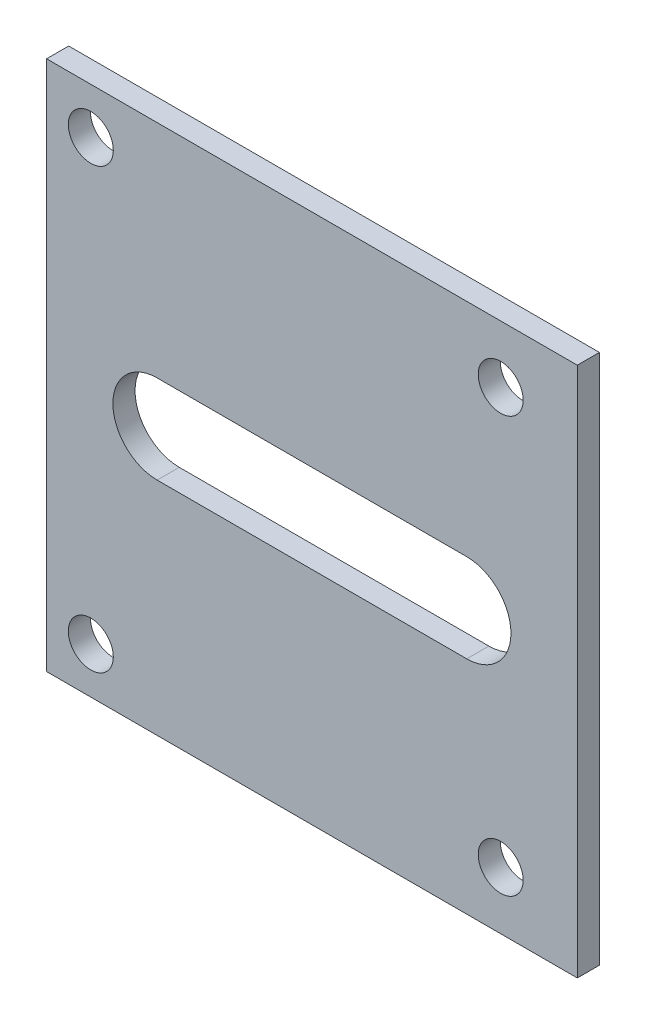
ISO-10303-21;
HEADER;
FILE_DESCRIPTION(('STEP AP214'),'2;1');
FILE_NAME('part.step','',(''),(''),'','','');
FILE_SCHEMA(('AUTOMOTIVE_DESIGN { 1 0 10303 214 1 1 1 1 }'));
ENDSEC;
DATA;
#1=APPLICATION_CONTEXT('core data for automotive mechanical design processes');
#2=APPLICATION_PROTOCOL_DEFINITION('international standard','automotive_design',2000,#1);
#3=PRODUCT_CONTEXT('',#1,'mechanical');
#4=PRODUCT('Part','Part','',(#3));
#5=PRODUCT_RELATED_PRODUCT_CATEGORY('part','',(#4));
#6=PRODUCT_DEFINITION_FORMATION('','',#4);
#7=PRODUCT_DEFINITION_CONTEXT('part definition',#1,'design');
#8=PRODUCT_DEFINITION('design','',#6,#7);
#9=PRODUCT_DEFINITION_SHAPE('','',#8);
#10=(LENGTH_UNIT() NAMED_UNIT(*) SI_UNIT(.MILLI.,.METRE.));
#11=(NAMED_UNIT(*) PLANE_ANGLE_UNIT() SI_UNIT($,.RADIAN.));
#12=(NAMED_UNIT(*) SI_UNIT($,.STERADIAN.) SOLID_ANGLE_UNIT());
#13=UNCERTAINTY_MEASURE_WITH_UNIT(LENGTH_MEASURE(1.E-05),#10,'distance_accuracy_value','');
#14=(GEOMETRIC_REPRESENTATION_CONTEXT(3) GLOBAL_UNCERTAINTY_ASSIGNED_CONTEXT((#13)) GLOBAL_UNIT_ASSIGNED_CONTEXT((#10,
#11,#12)) REPRESENTATION_CONTEXT('',''));
#15=CARTESIAN_POINT('',(0.,0.,0.));
#16=DIRECTION('',(0.,0.,1.));
#17=DIRECTION('',(1.,0.,0.));
#18=AXIS2_PLACEMENT_3D('',#15,#16,#17);
#19=CARTESIAN_POINT('',(0.,0.,3.175));
#20=DIRECTION('',(0.,0.,-1.));
#21=DIRECTION('',(-1.,0.,0.));
#22=AXIS2_PLACEMENT_3D('',#19,#20,#21);
#23=PLANE('',#22);
#24=DIRECTION('',(1.,0.,0.));
#25=VECTOR('',#24,1.);
#26=CARTESIAN_POINT('',(15.875,31.75,3.175));
#27=LINE('',#26,#25);
#28=CARTESIAN_POINT('',(15.875,31.75,3.175));
#29=VERTEX_POINT('',#28);
#30=CARTESIAN_POINT('',(60.325,31.75,3.175));
#31=VERTEX_POINT('',#30);
#32=EDGE_CURVE('E125',#29,#31,#27,.T.);
#33=ORIENTED_EDGE('',*,*,#32,.F.);
#34=CARTESIAN_POINT('',(15.875,38.1,3.175));
#35=DIRECTION('',(0.,0.,1.));
#36=DIRECTION('',(1.,0.,0.));
#37=AXIS2_PLACEMENT_3D('',#34,#35,#36);
#38=CIRCLE('',#37,6.35);
#39=CARTESIAN_POINT('',(15.875,44.45,3.175));
#40=VERTEX_POINT('',#39);
#41=EDGE_CURVE('E48',#40,#29,#38,.T.);
#42=ORIENTED_EDGE('',*,*,#41,.F.);
#43=DIRECTION('',(-1.,0.,0.));
#44=VECTOR('',#43,1.);
#45=CARTESIAN_POINT('',(15.875,44.45,3.175));
#46=LINE('',#45,#44);
#47=CARTESIAN_POINT('',(60.325,44.45,3.175));
#48=VERTEX_POINT('',#47);
#49=EDGE_CURVE('E116',#48,#40,#46,.T.);
#50=ORIENTED_EDGE('',*,*,#49,.F.);
#51=CARTESIAN_POINT('',(60.325,38.1,3.175));
#52=DIRECTION('',(0.,0.,1.));
#53=DIRECTION('',(1.,0.,0.));
#54=AXIS2_PLACEMENT_3D('',#51,#52,#53);
#55=CIRCLE('',#54,6.35);
#56=EDGE_CURVE('E119',#31,#48,#55,.T.);
#57=ORIENTED_EDGE('',*,*,#56,.F.);
#58=EDGE_LOOP('',(#33,#42,#50,#57));
#59=FACE_BOUND('',#58,.T.);
#60=CARTESIAN_POINT('',(65.2018,67.945,3.175));
#61=DIRECTION('',(0.,0.,1.));
#62=DIRECTION('',(1.,0.,0.));
#63=AXIS2_PLACEMENT_3D('',#60,#61,#62);
#64=CIRCLE('',#63,3.22909773874974);
#65=CARTESIAN_POINT('',(68.4308977387497,67.945,3.175));
#66=VERTEX_POINT('',#65);
#67=EDGE_CURVE('E141',#66,#66,#64,.T.);
#68=ORIENTED_EDGE('',*,*,#67,.F.);
#69=EDGE_LOOP('',(#68));
#70=FACE_BOUND('',#69,.T.);
#71=CARTESIAN_POINT('',(6.35,69.596,3.175));
#72=DIRECTION('',(0.,0.,1.));
#73=DIRECTION('',(1.,0.,0.));
#74=AXIS2_PLACEMENT_3D('',#71,#72,#73);
#75=CIRCLE('',#74,3.22909773874974);
#76=CARTESIAN_POINT('',(9.57909773874974,69.596,3.175));
#77=VERTEX_POINT('',#76);
#78=EDGE_CURVE('E153',#77,#77,#75,.T.);
#79=ORIENTED_EDGE('',*,*,#78,.F.);
#80=EDGE_LOOP('',(#79));
#81=FACE_BOUND('',#80,.T.);
#82=DIRECTION('',(0.,-1.,0.));
#83=VECTOR('',#82,1.);
#84=CARTESIAN_POINT('',(0.,0.,3.175));
#85=LINE('',#84,#83);
#86=CARTESIAN_POINT('',(0.,76.2,3.175));
#87=VERTEX_POINT('',#86);
#88=CARTESIAN_POINT('',(0.,0.,3.175));
#89=VERTEX_POINT('',#88);
#90=EDGE_CURVE('E159',#87,#89,#85,.T.);
#91=ORIENTED_EDGE('',*,*,#90,.T.);
#92=DIRECTION('',(1.,0.,0.));
#93=VECTOR('',#92,1.);
#94=CARTESIAN_POINT('',(0.,0.,3.175));
#95=LINE('',#94,#93);
#96=CARTESIAN_POINT('',(76.2,0.,3.175));
#97=VERTEX_POINT('',#96);
#98=EDGE_CURVE('E162',#89,#97,#95,.T.);
#99=ORIENTED_EDGE('',*,*,#98,.T.);
#100=DIRECTION('',(0.,1.,0.));
#101=VECTOR('',#100,1.);
#102=CARTESIAN_POINT('',(76.2,76.2,3.175));
#103=LINE('',#102,#101);
#104=CARTESIAN_POINT('',(76.2,76.2,3.175));
#105=VERTEX_POINT('',#104);
#106=EDGE_CURVE('E165',#97,#105,#103,.T.);
#107=ORIENTED_EDGE('',*,*,#106,.T.);
#108=DIRECTION('',(-1.,0.,0.));
#109=VECTOR('',#108,1.);
#110=CARTESIAN_POINT('',(0.,76.2,3.175));
#111=LINE('',#110,#109);
#112=EDGE_CURVE('E167',#105,#87,#111,.T.);
#113=ORIENTED_EDGE('',*,*,#112,.T.);
#114=EDGE_LOOP('',(#91,#99,#107,#113));
#115=FACE_BOUND('',#114,.T.);
#116=CARTESIAN_POINT('',(6.35,6.60400000000028,3.175));
#117=DIRECTION('',(0.,0.,1.));
#118=DIRECTION('',(1.,0.,0.));
#119=AXIS2_PLACEMENT_3D('',#116,#117,#118);
#120=CIRCLE('',#119,3.22909773874974);
#121=CARTESIAN_POINT('',(9.57909773874974,6.60400000000028,3.175));
#122=VERTEX_POINT('',#121);
#123=EDGE_CURVE('E147',#122,#122,#120,.T.);
#124=ORIENTED_EDGE('',*,*,#123,.F.);
#125=EDGE_LOOP('',(#124));
#126=FACE_BOUND('',#125,.T.);
#127=CARTESIAN_POINT('',(65.2018,8.25500000000001,3.175));
#128=DIRECTION('',(0.,0.,1.));
#129=DIRECTION('',(1.,0.,0.));
#130=AXIS2_PLACEMENT_3D('',#127,#128,#129);
#131=CIRCLE('',#130,3.22909773874974);
#132=CARTESIAN_POINT('',(68.4308977387497,8.25500000000001,3.175));
#133=VERTEX_POINT('',#132);
#134=EDGE_CURVE('E135',#133,#133,#131,.T.);
#135=ORIENTED_EDGE('',*,*,#134,.F.);
#136=EDGE_LOOP('',(#135));
#137=FACE_BOUND('',#136,.T.);
#138=ADVANCED_FACE('F33',(#59,#70,#81,#115,#126,#137),#23,.F.);
#139=CARTESIAN_POINT('',(0.,0.,0.));
#140=DIRECTION('',(0.,0.,-1.));
#141=DIRECTION('',(-1.,0.,0.));
#142=AXIS2_PLACEMENT_3D('',#139,#140,#141);
#143=PLANE('',#142);
#144=CARTESIAN_POINT('',(15.875,38.1,0.));
#145=DIRECTION('',(0.,0.,1.));
#146=DIRECTION('',(1.,0.,0.));
#147=AXIS2_PLACEMENT_3D('',#144,#145,#146);
#148=CIRCLE('',#147,6.35);
#149=CARTESIAN_POINT('',(15.875,44.45,0.));
#150=VERTEX_POINT('',#149);
#151=CARTESIAN_POINT('',(15.875,31.75,0.));
#152=VERTEX_POINT('',#151);
#153=EDGE_CURVE('E100',#150,#152,#148,.T.);
#154=ORIENTED_EDGE('',*,*,#153,.T.);
#155=DIRECTION('',(1.,0.,0.));
#156=VECTOR('',#155,1.);
#157=CARTESIAN_POINT('',(15.875,31.75,0.));
#158=LINE('',#157,#156);
#159=CARTESIAN_POINT('',(60.325,31.75,0.));
#160=VERTEX_POINT('',#159);
#161=EDGE_CURVE('E109',#152,#160,#158,.T.);
#162=ORIENTED_EDGE('',*,*,#161,.T.);
#163=CARTESIAN_POINT('',(60.325,38.1,0.));
#164=DIRECTION('',(0.,0.,1.));
#165=DIRECTION('',(1.,0.,0.));
#166=AXIS2_PLACEMENT_3D('',#163,#164,#165);
#167=CIRCLE('',#166,6.35);
#168=CARTESIAN_POINT('',(60.325,44.45,0.));
#169=VERTEX_POINT('',#168);
#170=EDGE_CURVE('E56',#160,#169,#167,.T.);
#171=ORIENTED_EDGE('',*,*,#170,.T.);
#172=DIRECTION('',(-1.,0.,0.));
#173=VECTOR('',#172,1.);
#174=CARTESIAN_POINT('',(15.875,44.45,0.));
#175=LINE('',#174,#173);
#176=EDGE_CURVE('E106',#169,#150,#175,.T.);
#177=ORIENTED_EDGE('',*,*,#176,.T.);
#178=EDGE_LOOP('',(#154,#162,#171,#177));
#179=FACE_BOUND('',#178,.T.);
#180=CARTESIAN_POINT('',(65.2018,67.945,0.));
#181=DIRECTION('',(0.,0.,1.));
#182=DIRECTION('',(1.,0.,0.));
#183=AXIS2_PLACEMENT_3D('',#180,#181,#182);
#184=CIRCLE('',#183,3.22909773874974);
#185=CARTESIAN_POINT('',(68.4308977387497,67.945,0.));
#186=VERTEX_POINT('',#185);
#187=EDGE_CURVE('E138',#186,#186,#184,.T.);
#188=ORIENTED_EDGE('',*,*,#187,.T.);
#189=EDGE_LOOP('',(#188));
#190=FACE_BOUND('',#189,.T.);
#191=CARTESIAN_POINT('',(6.35,69.596,0.));
#192=DIRECTION('',(0.,0.,1.));
#193=DIRECTION('',(1.,0.,0.));
#194=AXIS2_PLACEMENT_3D('',#191,#192,#193);
#195=CIRCLE('',#194,3.22909773874974);
#196=CARTESIAN_POINT('',(9.57909773874974,69.596,0.));
#197=VERTEX_POINT('',#196);
#198=EDGE_CURVE('E150',#197,#197,#195,.T.);
#199=ORIENTED_EDGE('',*,*,#198,.T.);
#200=EDGE_LOOP('',(#199));
#201=FACE_BOUND('',#200,.T.);
#202=DIRECTION('',(0.,-1.,0.));
#203=VECTOR('',#202,1.);
#204=CARTESIAN_POINT('',(0.,0.,0.));
#205=LINE('',#204,#203);
#206=CARTESIAN_POINT('',(0.,76.2,0.));
#207=VERTEX_POINT('',#206);
#208=CARTESIAN_POINT('',(0.,0.,0.));
#209=VERTEX_POINT('',#208);
#210=EDGE_CURVE('E156',#207,#209,#205,.T.);
#211=ORIENTED_EDGE('',*,*,#210,.F.);
#212=DIRECTION('',(-1.,0.,0.));
#213=VECTOR('',#212,1.);
#214=CARTESIAN_POINT('',(0.,76.2,0.));
#215=LINE('',#214,#213);
#216=CARTESIAN_POINT('',(76.2,76.2,0.));
#217=VERTEX_POINT('',#216);
#218=EDGE_CURVE('E163',#217,#207,#215,.T.);
#219=ORIENTED_EDGE('',*,*,#218,.F.);
#220=DIRECTION('',(0.,1.,0.));
#221=VECTOR('',#220,1.);
#222=CARTESIAN_POINT('',(76.2,76.2,0.));
#223=LINE('',#222,#221);
#224=CARTESIAN_POINT('',(76.2,0.,0.));
#225=VERTEX_POINT('',#224);
#226=EDGE_CURVE('E174',#225,#217,#223,.T.);
#227=ORIENTED_EDGE('',*,*,#226,.F.);
#228=DIRECTION('',(1.,0.,0.));
#229=VECTOR('',#228,1.);
#230=CARTESIAN_POINT('',(0.,0.,0.));
#231=LINE('',#230,#229);
#232=EDGE_CURVE('E172',#209,#225,#231,.T.);
#233=ORIENTED_EDGE('',*,*,#232,.F.);
#234=EDGE_LOOP('',(#211,#219,#227,#233));
#235=FACE_BOUND('',#234,.T.);
#236=CARTESIAN_POINT('',(6.35,6.60400000000028,0.));
#237=DIRECTION('',(0.,0.,1.));
#238=DIRECTION('',(1.,0.,0.));
#239=AXIS2_PLACEMENT_3D('',#236,#237,#238);
#240=CIRCLE('',#239,3.22909773874974);
#241=CARTESIAN_POINT('',(9.57909773874974,6.60400000000028,0.));
#242=VERTEX_POINT('',#241);
#243=EDGE_CURVE('E144',#242,#242,#240,.T.);
#244=ORIENTED_EDGE('',*,*,#243,.T.);
#245=EDGE_LOOP('',(#244));
#246=FACE_BOUND('',#245,.T.);
#247=CARTESIAN_POINT('',(65.2018,8.25500000000001,0.));
#248=DIRECTION('',(0.,0.,1.));
#249=DIRECTION('',(1.,0.,0.));
#250=AXIS2_PLACEMENT_3D('',#247,#248,#249);
#251=CIRCLE('',#250,3.22909773874974);
#252=CARTESIAN_POINT('',(68.4308977387497,8.25500000000001,0.));
#253=VERTEX_POINT('',#252);
#254=EDGE_CURVE('E131',#253,#253,#251,.T.);
#255=ORIENTED_EDGE('',*,*,#254,.T.);
#256=EDGE_LOOP('',(#255));
#257=FACE_BOUND('',#256,.T.);
#258=ADVANCED_FACE('F113',(#179,#190,#201,#235,#246,#257),#143,.T.);
#259=CARTESIAN_POINT('',(0.,0.,3.175));
#260=DIRECTION('',(1.,0.,0.));
#261=DIRECTION('',(0.,0.,-1.));
#262=AXIS2_PLACEMENT_3D('',#259,#260,#261);
#263=PLANE('',#262);
#264=ORIENTED_EDGE('',*,*,#210,.T.);
#265=DIRECTION('',(0.,0.,-1.));
#266=VECTOR('',#265,1.);
#267=CARTESIAN_POINT('',(0.,0.,3.175));
#268=LINE('',#267,#266);
#269=EDGE_CURVE('E11',#89,#209,#268,.T.);
#270=ORIENTED_EDGE('',*,*,#269,.F.);
#271=ORIENTED_EDGE('',*,*,#90,.F.);
#272=DIRECTION('',(0.,0.,-1.));
#273=VECTOR('',#272,1.);
#274=CARTESIAN_POINT('',(0.,76.2,3.175));
#275=LINE('',#274,#273);
#276=EDGE_CURVE('E169',#87,#207,#275,.T.);
#277=ORIENTED_EDGE('',*,*,#276,.T.);
#278=EDGE_LOOP('',(#264,#270,#271,#277));
#279=FACE_BOUND('',#278,.T.);
#280=ADVANCED_FACE('F35',(#279),#263,.F.);
#281=CARTESIAN_POINT('',(0.,0.,3.175));
#282=DIRECTION('',(0.,1.,0.));
#283=DIRECTION('',(0.,0.,1.));
#284=AXIS2_PLACEMENT_3D('',#281,#282,#283);
#285=PLANE('',#284);
#286=ORIENTED_EDGE('',*,*,#232,.T.);
#287=DIRECTION('',(0.,0.,-1.));
#288=VECTOR('',#287,1.);
#289=CARTESIAN_POINT('',(76.2,0.,3.175));
#290=LINE('',#289,#288);
#291=EDGE_CURVE('E41',#97,#225,#290,.T.);
#292=ORIENTED_EDGE('',*,*,#291,.F.);
#293=ORIENTED_EDGE('',*,*,#98,.F.);
#294=ORIENTED_EDGE('',*,*,#269,.T.);
#295=EDGE_LOOP('',(#286,#292,#293,#294));
#296=FACE_BOUND('',#295,.T.);
#297=ADVANCED_FACE('F202',(#296),#285,.F.);
#298=CARTESIAN_POINT('',(76.2,76.2,3.175));
#299=DIRECTION('',(-1.,0.,0.));
#300=DIRECTION('',(0.,-1.,0.));
#301=AXIS2_PLACEMENT_3D('',#298,#299,#300);
#302=PLANE('',#301);
#303=ORIENTED_EDGE('',*,*,#226,.T.);
#304=DIRECTION('',(0.,0.,-1.));
#305=VECTOR('',#304,1.);
#306=CARTESIAN_POINT('',(76.2,76.2,3.175));
#307=LINE('',#306,#305);
#308=EDGE_CURVE('E179',#105,#217,#307,.T.);
#309=ORIENTED_EDGE('',*,*,#308,.F.);
#310=ORIENTED_EDGE('',*,*,#106,.F.);
#311=ORIENTED_EDGE('',*,*,#291,.T.);
#312=EDGE_LOOP('',(#303,#309,#310,#311));
#313=FACE_BOUND('',#312,.T.);
#314=ADVANCED_FACE('F186',(#313),#302,.F.);
#315=CARTESIAN_POINT('',(0.,76.2,3.175));
#316=DIRECTION('',(0.,-1.,0.));
#317=DIRECTION('',(1.,0.,0.));
#318=AXIS2_PLACEMENT_3D('',#315,#316,#317);
#319=PLANE('',#318);
#320=ORIENTED_EDGE('',*,*,#218,.T.);
#321=ORIENTED_EDGE('',*,*,#276,.F.);
#322=ORIENTED_EDGE('',*,*,#112,.F.);
#323=ORIENTED_EDGE('',*,*,#308,.T.);
#324=EDGE_LOOP('',(#320,#321,#322,#323));
#325=FACE_BOUND('',#324,.T.);
#326=ADVANCED_FACE('F195',(#325),#319,.F.);
#327=CARTESIAN_POINT('',(6.35,69.596,3.175));
#328=DIRECTION('',(0.,0.,-1.));
#329=DIRECTION('',(-1.,0.,0.));
#330=AXIS2_PLACEMENT_3D('',#327,#328,#329);
#331=CYLINDRICAL_SURFACE('',#330,3.22909773874974);
#332=ORIENTED_EDGE('',*,*,#78,.T.);
#333=EDGE_LOOP('',(#332));
#334=FACE_BOUND('',#333,.T.);
#335=ORIENTED_EDGE('',*,*,#198,.F.);
#336=EDGE_LOOP('',(#335));
#337=FACE_BOUND('',#336,.T.);
#338=ADVANCED_FACE('F218',(#334,#337),#331,.F.);
#339=CARTESIAN_POINT('',(6.35,6.60400000000028,3.175));
#340=DIRECTION('',(0.,0.,-1.));
#341=DIRECTION('',(-1.,0.,0.));
#342=AXIS2_PLACEMENT_3D('',#339,#340,#341);
#343=CYLINDRICAL_SURFACE('',#342,3.22909773874974);
#344=ORIENTED_EDGE('',*,*,#123,.T.);
#345=EDGE_LOOP('',(#344));
#346=FACE_BOUND('',#345,.T.);
#347=ORIENTED_EDGE('',*,*,#243,.F.);
#348=EDGE_LOOP('',(#347));
#349=FACE_BOUND('',#348,.T.);
#350=ADVANCED_FACE('F225',(#346,#349),#343,.F.);
#351=CARTESIAN_POINT('',(65.2018,67.945,3.175));
#352=DIRECTION('',(0.,0.,-1.));
#353=DIRECTION('',(-1.,0.,0.));
#354=AXIS2_PLACEMENT_3D('',#351,#352,#353);
#355=CYLINDRICAL_SURFACE('',#354,3.22909773874974);
#356=ORIENTED_EDGE('',*,*,#67,.T.);
#357=EDGE_LOOP('',(#356));
#358=FACE_BOUND('',#357,.T.);
#359=ORIENTED_EDGE('',*,*,#187,.F.);
#360=EDGE_LOOP('',(#359));
#361=FACE_BOUND('',#360,.T.);
#362=ADVANCED_FACE('F230',(#358,#361),#355,.F.);
#363=CARTESIAN_POINT('',(65.2018,8.25500000000001,3.175));
#364=DIRECTION('',(0.,0.,-1.));
#365=DIRECTION('',(-1.,0.,0.));
#366=AXIS2_PLACEMENT_3D('',#363,#364,#365);
#367=CYLINDRICAL_SURFACE('',#366,3.22909773874974);
#368=ORIENTED_EDGE('',*,*,#134,.T.);
#369=EDGE_LOOP('',(#368));
#370=FACE_BOUND('',#369,.T.);
#371=ORIENTED_EDGE('',*,*,#254,.F.);
#372=EDGE_LOOP('',(#371));
#373=FACE_BOUND('',#372,.T.);
#374=ADVANCED_FACE('F240',(#370,#373),#367,.F.);
#375=CARTESIAN_POINT('',(15.875,38.1,0.));
#376=DIRECTION('',(0.,0.,1.));
#377=DIRECTION('',(1.,0.,0.));
#378=AXIS2_PLACEMENT_3D('',#375,#376,#377);
#379=CYLINDRICAL_SURFACE('',#378,6.35);
#380=ORIENTED_EDGE('',*,*,#41,.T.);
#381=DIRECTION('',(0.,0.,1.));
#382=VECTOR('',#381,1.);
#383=CARTESIAN_POINT('',(15.875,31.75,0.));
#384=LINE('',#383,#382);
#385=EDGE_CURVE('E96',#152,#29,#384,.T.);
#386=ORIENTED_EDGE('',*,*,#385,.F.);
#387=ORIENTED_EDGE('',*,*,#153,.F.);
#388=DIRECTION('',(0.,0.,1.));
#389=VECTOR('',#388,1.);
#390=CARTESIAN_POINT('',(15.875,44.45,0.));
#391=LINE('',#390,#389);
#392=EDGE_CURVE('E129',#150,#40,#391,.T.);
#393=ORIENTED_EDGE('',*,*,#392,.T.);
#394=EDGE_LOOP('',(#380,#386,#387,#393));
#395=FACE_BOUND('',#394,.T.);
#396=ADVANCED_FACE('F98',(#395),#379,.F.);
#397=CARTESIAN_POINT('',(15.875,44.45,0.));
#398=DIRECTION('',(0.,1.,0.));
#399=DIRECTION('',(-1.,0.,0.));
#400=AXIS2_PLACEMENT_3D('',#397,#398,#399);
#401=PLANE('',#400);
#402=ORIENTED_EDGE('',*,*,#49,.T.);
#403=ORIENTED_EDGE('',*,*,#392,.F.);
#404=ORIENTED_EDGE('',*,*,#176,.F.);
#405=DIRECTION('',(0.,0.,1.));
#406=VECTOR('',#405,1.);
#407=CARTESIAN_POINT('',(60.325,44.45,0.));
#408=LINE('',#407,#406);
#409=EDGE_CURVE('E132',#169,#48,#408,.T.);
#410=ORIENTED_EDGE('',*,*,#409,.T.);
#411=EDGE_LOOP('',(#402,#403,#404,#410));
#412=FACE_BOUND('',#411,.T.);
#413=ADVANCED_FACE('F250',(#412),#401,.F.);
#414=CARTESIAN_POINT('',(60.325,38.1,0.));
#415=DIRECTION('',(0.,0.,1.));
#416=DIRECTION('',(1.,0.,0.));
#417=AXIS2_PLACEMENT_3D('',#414,#415,#416);
#418=CYLINDRICAL_SURFACE('',#417,6.35);
#419=ORIENTED_EDGE('',*,*,#56,.T.);
#420=ORIENTED_EDGE('',*,*,#409,.F.);
#421=ORIENTED_EDGE('',*,*,#170,.F.);
#422=DIRECTION('',(0.,0.,1.));
#423=VECTOR('',#422,1.);
#424=CARTESIAN_POINT('',(60.325,31.75,0.));
#425=LINE('',#424,#423);
#426=EDGE_CURVE('E105',#160,#31,#425,.T.);
#427=ORIENTED_EDGE('',*,*,#426,.T.);
#428=EDGE_LOOP('',(#419,#420,#421,#427));
#429=FACE_BOUND('',#428,.T.);
#430=ADVANCED_FACE('F253',(#429),#418,.F.);
#431=CARTESIAN_POINT('',(15.875,31.75,0.));
#432=DIRECTION('',(0.,-1.,0.));
#433=DIRECTION('',(1.,0.,0.));
#434=AXIS2_PLACEMENT_3D('',#431,#432,#433);
#435=PLANE('',#434);
#436=ORIENTED_EDGE('',*,*,#32,.T.);
#437=ORIENTED_EDGE('',*,*,#426,.F.);
#438=ORIENTED_EDGE('',*,*,#161,.F.);
#439=ORIENTED_EDGE('',*,*,#385,.T.);
#440=EDGE_LOOP('',(#436,#437,#438,#439));
#441=FACE_BOUND('',#440,.T.);
#442=ADVANCED_FACE('F110',(#441),#435,.F.);
#443=CLOSED_SHELL('',(#138,#258,#280,#297,#314,#326,#338,#350,#362,#374,#396,#413,#430,#442));
#444=MANIFOLD_SOLID_BREP('B2',#443);
#445=ADVANCED_BREP_SHAPE_REPRESENTATION('',(#18,#444),#14);
#446=SHAPE_DEFINITION_REPRESENTATION(#9,#445);
ENDSEC;
END-ISO-10303-21;
